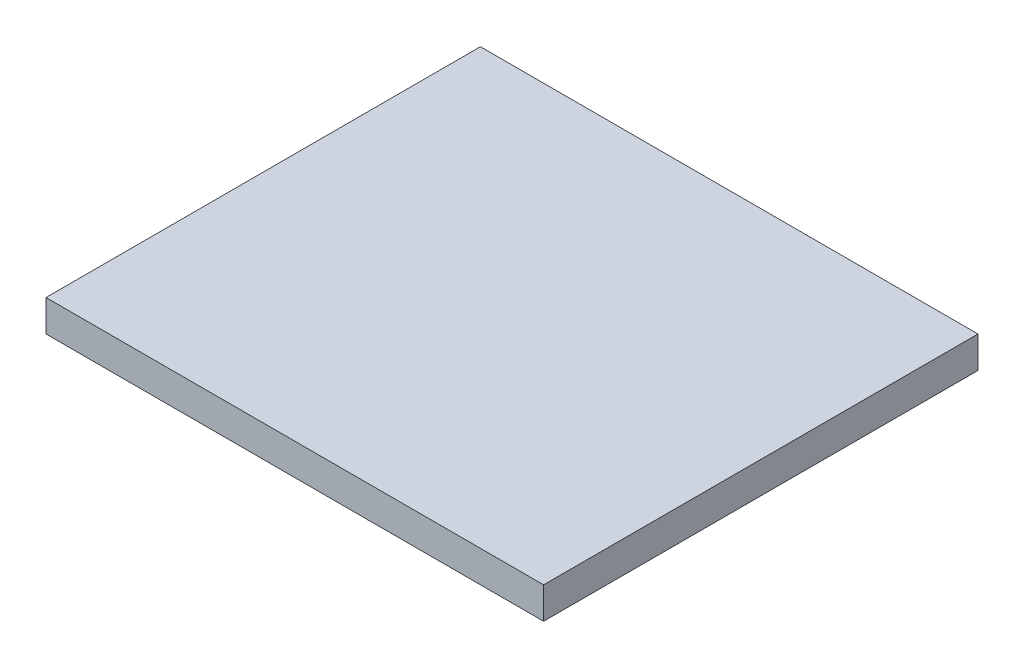
ISO-10303-21;
HEADER;
FILE_DESCRIPTION(('STEP AP214'),'2;1');
FILE_NAME('part.step','',(''),(''),'','','');
FILE_SCHEMA(('AUTOMOTIVE_DESIGN { 1 0 10303 214 1 1 1 1 }'));
ENDSEC;
DATA;
#1=APPLICATION_CONTEXT('core data for automotive mechanical design processes');
#2=APPLICATION_PROTOCOL_DEFINITION('international standard','automotive_design',2000,#1);
#3=PRODUCT_CONTEXT('',#1,'mechanical');
#4=PRODUCT('Part','Part','',(#3));
#5=PRODUCT_RELATED_PRODUCT_CATEGORY('part','',(#4));
#6=PRODUCT_DEFINITION_FORMATION('','',#4);
#7=PRODUCT_DEFINITION_CONTEXT('part definition',#1,'design');
#8=PRODUCT_DEFINITION('design','',#6,#7);
#9=PRODUCT_DEFINITION_SHAPE('','',#8);
#10=(LENGTH_UNIT() NAMED_UNIT(*) SI_UNIT(.MILLI.,.METRE.));
#11=(NAMED_UNIT(*) PLANE_ANGLE_UNIT() SI_UNIT($,.RADIAN.));
#12=(NAMED_UNIT(*) SI_UNIT($,.STERADIAN.) SOLID_ANGLE_UNIT());
#13=UNCERTAINTY_MEASURE_WITH_UNIT(LENGTH_MEASURE(1.E-05),#10,'distance_accuracy_value','');
#14=(GEOMETRIC_REPRESENTATION_CONTEXT(3) GLOBAL_UNCERTAINTY_ASSIGNED_CONTEXT((#13)) GLOBAL_UNIT_ASSIGNED_CONTEXT((#10,
#11,#12)) REPRESENTATION_CONTEXT('',''));
#15=CARTESIAN_POINT('',(0.,0.,0.));
#16=DIRECTION('',(0.,0.,1.));
#17=DIRECTION('',(1.,0.,0.));
#18=AXIS2_PLACEMENT_3D('',#15,#16,#17);
#19=CARTESIAN_POINT('',(31.5,4.,-27.5));
#20=DIRECTION('',(-1.,0.,0.));
#21=DIRECTION('',(0.,0.,1.));
#22=AXIS2_PLACEMENT_3D('',#19,#20,#21);
#23=PLANE('',#22);
#24=DIRECTION('',(0.,0.,-1.));
#25=VECTOR('',#24,1.);
#26=CARTESIAN_POINT('',(31.5,0.,-27.5));
#27=LINE('',#26,#25);
#28=CARTESIAN_POINT('',(31.5,0.,27.5));
#29=VERTEX_POINT('',#28);
#30=CARTESIAN_POINT('',(31.5,0.,-27.5));
#31=VERTEX_POINT('',#30);
#32=EDGE_CURVE('E96',#29,#31,#27,.T.);
#33=ORIENTED_EDGE('',*,*,#32,.T.);
#34=DIRECTION('',(0.,-1.,0.));
#35=VECTOR('',#34,1.);
#36=CARTESIAN_POINT('',(31.5,4.,-27.5));
#37=LINE('',#36,#35);
#38=CARTESIAN_POINT('',(31.5,4.,-27.5));
#39=VERTEX_POINT('',#38);
#40=EDGE_CURVE('E11',#39,#31,#37,.T.);
#41=ORIENTED_EDGE('',*,*,#40,.F.);
#42=DIRECTION('',(0.,0.,-1.));
#43=VECTOR('',#42,1.);
#44=CARTESIAN_POINT('',(31.5,4.,-27.5));
#45=LINE('',#44,#43);
#46=CARTESIAN_POINT('',(31.5,4.,27.5));
#47=VERTEX_POINT('',#46);
#48=EDGE_CURVE('E84',#47,#39,#45,.T.);
#49=ORIENTED_EDGE('',*,*,#48,.F.);
#50=DIRECTION('',(0.,-1.,0.));
#51=VECTOR('',#50,1.);
#52=CARTESIAN_POINT('',(31.5,4.,27.5));
#53=LINE('',#52,#51);
#54=EDGE_CURVE('E92',#47,#29,#53,.T.);
#55=ORIENTED_EDGE('',*,*,#54,.T.);
#56=EDGE_LOOP('',(#33,#41,#49,#55));
#57=FACE_BOUND('',#56,.T.);
#58=ADVANCED_FACE('F33',(#57),#23,.F.);
#59=CARTESIAN_POINT('',(-31.5,4.,-27.5));
#60=DIRECTION('',(0.,0.,1.));
#61=DIRECTION('',(1.,0.,0.));
#62=AXIS2_PLACEMENT_3D('',#59,#60,#61);
#63=PLANE('',#62);
#64=DIRECTION('',(-1.,0.,0.));
#65=VECTOR('',#64,1.);
#66=CARTESIAN_POINT('',(-31.5,0.,-27.5));
#67=LINE('',#66,#65);
#68=CARTESIAN_POINT('',(-31.5,0.,-27.5));
#69=VERTEX_POINT('',#68);
#70=EDGE_CURVE('E88',#31,#69,#67,.T.);
#71=ORIENTED_EDGE('',*,*,#70,.T.);
#72=DIRECTION('',(0.,-1.,0.));
#73=VECTOR('',#72,1.);
#74=CARTESIAN_POINT('',(-31.5,4.,-27.5));
#75=LINE('',#74,#73);
#76=CARTESIAN_POINT('',(-31.5,4.,-27.5));
#77=VERTEX_POINT('',#76);
#78=EDGE_CURVE('E41',#77,#69,#75,.T.);
#79=ORIENTED_EDGE('',*,*,#78,.F.);
#80=DIRECTION('',(-1.,0.,0.));
#81=VECTOR('',#80,1.);
#82=CARTESIAN_POINT('',(-31.5,4.,-27.5));
#83=LINE('',#82,#81);
#84=EDGE_CURVE('E79',#39,#77,#83,.T.);
#85=ORIENTED_EDGE('',*,*,#84,.F.);
#86=ORIENTED_EDGE('',*,*,#40,.T.);
#87=EDGE_LOOP('',(#71,#79,#85,#86));
#88=FACE_BOUND('',#87,.T.);
#89=ADVANCED_FACE('F87',(#88),#63,.F.);
#90=CARTESIAN_POINT('',(-31.5,4.,-27.5));
#91=DIRECTION('',(1.,0.,0.));
#92=DIRECTION('',(0.,0.,-1.));
#93=AXIS2_PLACEMENT_3D('',#90,#91,#92);
#94=PLANE('',#93);
#95=DIRECTION('',(0.,0.,1.));
#96=VECTOR('',#95,1.);
#97=CARTESIAN_POINT('',(-31.5,0.,-27.5));
#98=LINE('',#97,#96);
#99=CARTESIAN_POINT('',(-31.5,0.,27.5));
#100=VERTEX_POINT('',#99);
#101=EDGE_CURVE('E66',#69,#100,#98,.T.);
#102=ORIENTED_EDGE('',*,*,#101,.T.);
#103=DIRECTION('',(0.,-1.,0.));
#104=VECTOR('',#103,1.);
#105=CARTESIAN_POINT('',(-31.5,4.,27.5));
#106=LINE('',#105,#104);
#107=CARTESIAN_POINT('',(-31.5,4.,27.5));
#108=VERTEX_POINT('',#107);
#109=EDGE_CURVE('E89',#108,#100,#106,.T.);
#110=ORIENTED_EDGE('',*,*,#109,.F.);
#111=DIRECTION('',(0.,0.,1.));
#112=VECTOR('',#111,1.);
#113=CARTESIAN_POINT('',(-31.5,4.,-27.5));
#114=LINE('',#113,#112);
#115=EDGE_CURVE('E82',#77,#108,#114,.T.);
#116=ORIENTED_EDGE('',*,*,#115,.F.);
#117=ORIENTED_EDGE('',*,*,#78,.T.);
#118=EDGE_LOOP('',(#102,#110,#116,#117));
#119=FACE_BOUND('',#118,.T.);
#120=ADVANCED_FACE('F90',(#119),#94,.F.);
#121=CARTESIAN_POINT('',(-31.5,4.,27.5));
#122=DIRECTION('',(0.,0.,-1.));
#123=DIRECTION('',(-1.,0.,0.));
#124=AXIS2_PLACEMENT_3D('',#121,#122,#123);
#125=PLANE('',#124);
#126=DIRECTION('',(1.,0.,0.));
#127=VECTOR('',#126,1.);
#128=CARTESIAN_POINT('',(-31.5,0.,27.5));
#129=LINE('',#128,#127);
#130=EDGE_CURVE('E72',#100,#29,#129,.T.);
#131=ORIENTED_EDGE('',*,*,#130,.T.);
#132=ORIENTED_EDGE('',*,*,#54,.F.);
#133=DIRECTION('',(1.,0.,0.));
#134=VECTOR('',#133,1.);
#135=CARTESIAN_POINT('',(-31.5,4.,27.5));
#136=LINE('',#135,#134);
#137=EDGE_CURVE('E49',#108,#47,#136,.T.);
#138=ORIENTED_EDGE('',*,*,#137,.F.);
#139=ORIENTED_EDGE('',*,*,#109,.T.);
#140=EDGE_LOOP('',(#131,#132,#138,#139));
#141=FACE_BOUND('',#140,.T.);
#142=ADVANCED_FACE('F103',(#141),#125,.F.);
#143=CARTESIAN_POINT('',(0.,4.,0.));
#144=DIRECTION('',(0.,1.,0.));
#145=DIRECTION('',(0.,0.,1.));
#146=AXIS2_PLACEMENT_3D('',#143,#144,#145);
#147=PLANE('',#146);
#148=ORIENTED_EDGE('',*,*,#48,.T.);
#149=ORIENTED_EDGE('',*,*,#84,.T.);
#150=ORIENTED_EDGE('',*,*,#115,.T.);
#151=ORIENTED_EDGE('',*,*,#137,.T.);
#152=EDGE_LOOP('',(#148,#149,#150,#151));
#153=FACE_BOUND('',#152,.T.);
#154=ADVANCED_FACE('F80',(#153),#147,.T.);
#155=CARTESIAN_POINT('',(0.,0.,0.));
#156=DIRECTION('',(0.,1.,0.));
#157=DIRECTION('',(0.,0.,1.));
#158=AXIS2_PLACEMENT_3D('',#155,#156,#157);
#159=PLANE('',#158);
#160=ORIENTED_EDGE('',*,*,#32,.F.);
#161=ORIENTED_EDGE('',*,*,#130,.F.);
#162=ORIENTED_EDGE('',*,*,#101,.F.);
#163=ORIENTED_EDGE('',*,*,#70,.F.);
#164=EDGE_LOOP('',(#160,#161,#162,#163));
#165=FACE_BOUND('',#164,.T.);
#166=ADVANCED_FACE('F106',(#165),#159,.F.);
#167=CLOSED_SHELL('',(#58,#89,#120,#142,#154,#166));
#168=MANIFOLD_SOLID_BREP('B2',#167);
#169=ADVANCED_BREP_SHAPE_REPRESENTATION('',(#18,#168),#14);
#170=SHAPE_DEFINITION_REPRESENTATION(#9,#169);
ENDSEC;
END-ISO-10303-21;
